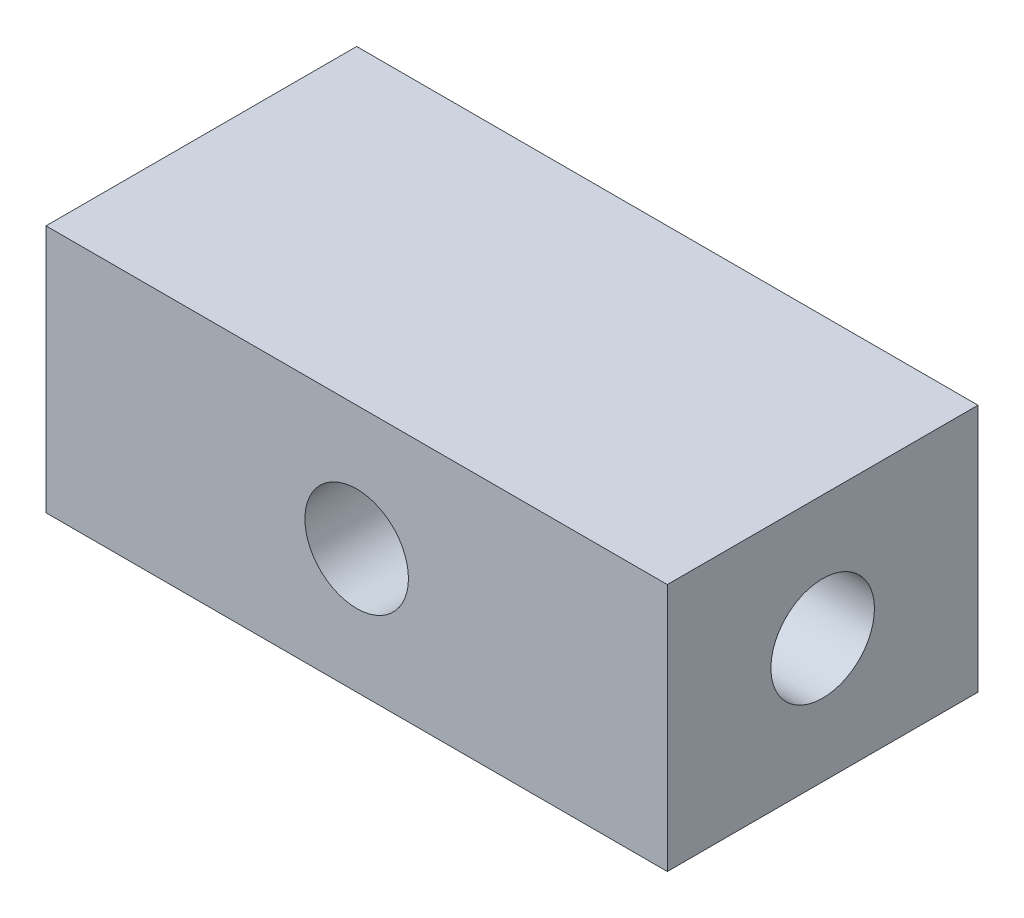
ISO-10303-21;
HEADER;
FILE_DESCRIPTION(('STEP AP214'),'2;1');
FILE_NAME('part.step','',(''),(''),'','','');
FILE_SCHEMA(('AUTOMOTIVE_DESIGN { 1 0 10303 214 1 1 1 1 }'));
ENDSEC;
DATA;
#1=APPLICATION_CONTEXT('core data for automotive mechanical design processes');
#2=APPLICATION_PROTOCOL_DEFINITION('international standard','automotive_design',2000,#1);
#3=PRODUCT_CONTEXT('',#1,'mechanical');
#4=PRODUCT('Part','Part','',(#3));
#5=PRODUCT_RELATED_PRODUCT_CATEGORY('part','',(#4));
#6=PRODUCT_DEFINITION_FORMATION('','',#4);
#7=PRODUCT_DEFINITION_CONTEXT('part definition',#1,'design');
#8=PRODUCT_DEFINITION('design','',#6,#7);
#9=PRODUCT_DEFINITION_SHAPE('','',#8);
#10=(LENGTH_UNIT() NAMED_UNIT(*) SI_UNIT(.MILLI.,.METRE.));
#11=(NAMED_UNIT(*) PLANE_ANGLE_UNIT() SI_UNIT($,.RADIAN.));
#12=(NAMED_UNIT(*) SI_UNIT($,.STERADIAN.) SOLID_ANGLE_UNIT());
#13=UNCERTAINTY_MEASURE_WITH_UNIT(LENGTH_MEASURE(1.E-05),#10,'distance_accuracy_value','');
#14=(GEOMETRIC_REPRESENTATION_CONTEXT(3) GLOBAL_UNCERTAINTY_ASSIGNED_CONTEXT((#13)) GLOBAL_UNIT_ASSIGNED_CONTEXT((#10,
#11,#12)) REPRESENTATION_CONTEXT('',''));
#15=CARTESIAN_POINT('',(0.,0.,0.));
#16=DIRECTION('',(0.,0.,1.));
#17=DIRECTION('',(1.,0.,0.));
#18=AXIS2_PLACEMENT_3D('',#15,#16,#17);
#19=CARTESIAN_POINT('',(0.,0.,7.5));
#20=DIRECTION('',(0.,0.,-1.));
#21=DIRECTION('',(-1.,0.,0.));
#22=AXIS2_PLACEMENT_3D('',#19,#20,#21);
#23=CYLINDRICAL_SURFACE('',#22,2.5);
#24=CARTESIAN_POINT('',(0.,0.,0.));
#25=DIRECTION('',(0.707106781186547,0.,-0.707106781186547));
#26=DIRECTION('',(-0.707106781186547,0.,-0.707106781186547));
#27=AXIS2_PLACEMENT_3D('',#24,#25,#26);
#28=ELLIPSE('',#27,3.53553390593274,2.5);
#29=CARTESIAN_POINT('',(0.,-2.5,0.));
#30=VERTEX_POINT('',#29);
#31=CARTESIAN_POINT('',(0.,2.5,0.));
#32=VERTEX_POINT('',#31);
#33=EDGE_CURVE('E11',#30,#32,#28,.F.);
#34=ORIENTED_EDGE('',*,*,#33,.F.);
#35=CARTESIAN_POINT('',(0.,0.,0.));
#36=DIRECTION('',(-0.707106781186547,0.,-0.707106781186547));
#37=DIRECTION('',(0.707106781186547,0.,-0.707106781186547));
#38=AXIS2_PLACEMENT_3D('',#35,#36,#37);
#39=ELLIPSE('',#38,3.53553390593274,2.5);
#40=EDGE_CURVE('E48',#32,#30,#39,.F.);
#41=ORIENTED_EDGE('',*,*,#40,.F.);
#42=EDGE_LOOP('',(#34,#41));
#43=FACE_BOUND('',#42,.T.);
#44=CARTESIAN_POINT('',(0.,0.,7.5));
#45=DIRECTION('',(0.,0.,1.));
#46=DIRECTION('',(1.,0.,0.));
#47=AXIS2_PLACEMENT_3D('',#44,#45,#46);
#48=CIRCLE('',#47,2.5);
#49=CARTESIAN_POINT('',(2.5,0.,7.5));
#50=VERTEX_POINT('',#49);
#51=EDGE_CURVE('E123',#50,#50,#48,.T.);
#52=ORIENTED_EDGE('',*,*,#51,.T.);
#53=EDGE_LOOP('',(#52));
#54=FACE_BOUND('',#53,.T.);
#55=ADVANCED_FACE('F34',(#43,#54),#23,.F.);
#56=CARTESIAN_POINT('',(-15.,6.,7.5));
#57=DIRECTION('',(0.,0.,1.));
#58=DIRECTION('',(1.,0.,0.));
#59=AXIS2_PLACEMENT_3D('',#56,#57,#58);
#60=PLANE('',#59);
#61=DIRECTION('',(0.,-1.,0.));
#62=VECTOR('',#61,1.);
#63=CARTESIAN_POINT('',(-15.,-6.,7.5));
#64=LINE('',#63,#62);
#65=CARTESIAN_POINT('',(-15.,6.,7.5));
#66=VERTEX_POINT('',#65);
#67=CARTESIAN_POINT('',(-15.,-6.,7.5));
#68=VERTEX_POINT('',#67);
#69=EDGE_CURVE('E115',#66,#68,#64,.T.);
#70=ORIENTED_EDGE('',*,*,#69,.T.);
#71=DIRECTION('',(1.,0.,0.));
#72=VECTOR('',#71,1.);
#73=CARTESIAN_POINT('',(15.,-6.,7.5));
#74=LINE('',#73,#72);
#75=CARTESIAN_POINT('',(15.,-6.,7.5));
#76=VERTEX_POINT('',#75);
#77=EDGE_CURVE('E86',#68,#76,#74,.T.);
#78=ORIENTED_EDGE('',*,*,#77,.T.);
#79=DIRECTION('',(0.,1.,0.));
#80=VECTOR('',#79,1.);
#81=CARTESIAN_POINT('',(15.,-6.,7.5));
#82=LINE('',#81,#80);
#83=CARTESIAN_POINT('',(15.,6.,7.5));
#84=VERTEX_POINT('',#83);
#85=EDGE_CURVE('E125',#76,#84,#82,.T.);
#86=ORIENTED_EDGE('',*,*,#85,.T.);
#87=DIRECTION('',(-1.,0.,0.));
#88=VECTOR('',#87,1.);
#89=CARTESIAN_POINT('',(15.,6.,7.5));
#90=LINE('',#89,#88);
#91=EDGE_CURVE('E57',#84,#66,#90,.T.);
#92=ORIENTED_EDGE('',*,*,#91,.T.);
#93=EDGE_LOOP('',(#70,#78,#86,#92));
#94=FACE_BOUND('',#93,.T.);
#95=ORIENTED_EDGE('',*,*,#51,.F.);
#96=EDGE_LOOP('',(#95));
#97=FACE_BOUND('',#96,.T.);
#98=ADVANCED_FACE('F157',(#94,#97),#60,.T.);
#99=CARTESIAN_POINT('',(-15.,6.,-7.5));
#100=DIRECTION('',(0.,0.,1.));
#101=DIRECTION('',(1.,0.,0.));
#102=AXIS2_PLACEMENT_3D('',#99,#100,#101);
#103=PLANE('',#102);
#104=DIRECTION('',(0.,-1.,0.));
#105=VECTOR('',#104,1.);
#106=CARTESIAN_POINT('',(-15.,-6.,-7.5));
#107=LINE('',#106,#105);
#108=CARTESIAN_POINT('',(-15.,6.,-7.5));
#109=VERTEX_POINT('',#108);
#110=CARTESIAN_POINT('',(-15.,-6.,-7.5));
#111=VERTEX_POINT('',#110);
#112=EDGE_CURVE('E120',#109,#111,#107,.T.);
#113=ORIENTED_EDGE('',*,*,#112,.F.);
#114=DIRECTION('',(-1.,0.,0.));
#115=VECTOR('',#114,1.);
#116=CARTESIAN_POINT('',(15.,6.,-7.5));
#117=LINE('',#116,#115);
#118=CARTESIAN_POINT('',(15.,6.,-7.5));
#119=VERTEX_POINT('',#118);
#120=EDGE_CURVE('E78',#119,#109,#117,.T.);
#121=ORIENTED_EDGE('',*,*,#120,.F.);
#122=DIRECTION('',(0.,1.,0.));
#123=VECTOR('',#122,1.);
#124=CARTESIAN_POINT('',(15.,-6.,-7.5));
#125=LINE('',#124,#123);
#126=CARTESIAN_POINT('',(15.,-6.,-7.5));
#127=VERTEX_POINT('',#126);
#128=EDGE_CURVE('E116',#127,#119,#125,.T.);
#129=ORIENTED_EDGE('',*,*,#128,.F.);
#130=DIRECTION('',(1.,0.,0.));
#131=VECTOR('',#130,1.);
#132=CARTESIAN_POINT('',(15.,-6.,-7.5));
#133=LINE('',#132,#131);
#134=EDGE_CURVE('E118',#111,#127,#133,.T.);
#135=ORIENTED_EDGE('',*,*,#134,.F.);
#136=EDGE_LOOP('',(#113,#121,#129,#135));
#137=FACE_BOUND('',#136,.T.);
#138=CARTESIAN_POINT('',(0.,0.,-7.5));
#139=DIRECTION('',(0.,0.,1.));
#140=DIRECTION('',(1.,0.,0.));
#141=AXIS2_PLACEMENT_3D('',#138,#139,#140);
#142=CIRCLE('',#141,2.5);
#143=CARTESIAN_POINT('',(2.5,0.,-7.5));
#144=VERTEX_POINT('',#143);
#145=EDGE_CURVE('E129',#144,#144,#142,.T.);
#146=ORIENTED_EDGE('',*,*,#145,.T.);
#147=EDGE_LOOP('',(#146));
#148=FACE_BOUND('',#147,.T.);
#149=ADVANCED_FACE('F152',(#137,#148),#103,.F.);
#150=CARTESIAN_POINT('',(-15.,-6.,7.5));
#151=DIRECTION('',(1.,0.,0.));
#152=DIRECTION('',(0.,0.,-1.));
#153=AXIS2_PLACEMENT_3D('',#150,#151,#152);
#154=PLANE('',#153);
#155=CARTESIAN_POINT('',(-15.,0.,0.));
#156=DIRECTION('',(1.,0.,0.));
#157=DIRECTION('',(0.,0.,-1.));
#158=AXIS2_PLACEMENT_3D('',#155,#156,#157);
#159=CIRCLE('',#158,2.5);
#160=CARTESIAN_POINT('',(-15.,0.,-2.5));
#161=VERTEX_POINT('',#160);
#162=EDGE_CURVE('E132',#161,#161,#159,.F.);
#163=ORIENTED_EDGE('',*,*,#162,.F.);
#164=EDGE_LOOP('',(#163));
#165=FACE_BOUND('',#164,.T.);
#166=ORIENTED_EDGE('',*,*,#112,.T.);
#167=DIRECTION('',(0.,0.,-1.));
#168=VECTOR('',#167,1.);
#169=CARTESIAN_POINT('',(-15.,-6.,7.5));
#170=LINE('',#169,#168);
#171=EDGE_CURVE('E100',#68,#111,#170,.T.);
#172=ORIENTED_EDGE('',*,*,#171,.F.);
#173=ORIENTED_EDGE('',*,*,#69,.F.);
#174=DIRECTION('',(0.,0.,-1.));
#175=VECTOR('',#174,1.);
#176=CARTESIAN_POINT('',(-15.,6.,7.5));
#177=LINE('',#176,#175);
#178=EDGE_CURVE('E112',#66,#109,#177,.T.);
#179=ORIENTED_EDGE('',*,*,#178,.T.);
#180=EDGE_LOOP('',(#166,#172,#173,#179));
#181=FACE_BOUND('',#180,.T.);
#182=ADVANCED_FACE('F36',(#165,#181),#154,.F.);
#183=CARTESIAN_POINT('',(15.,-6.,7.5));
#184=DIRECTION('',(0.,1.,0.));
#185=DIRECTION('',(-1.,0.,0.));
#186=AXIS2_PLACEMENT_3D('',#183,#184,#185);
#187=PLANE('',#186);
#188=ORIENTED_EDGE('',*,*,#134,.T.);
#189=DIRECTION('',(0.,0.,-1.));
#190=VECTOR('',#189,1.);
#191=CARTESIAN_POINT('',(15.,-6.,7.5));
#192=LINE('',#191,#190);
#193=EDGE_CURVE('E107',#76,#127,#192,.T.);
#194=ORIENTED_EDGE('',*,*,#193,.F.);
#195=ORIENTED_EDGE('',*,*,#77,.F.);
#196=ORIENTED_EDGE('',*,*,#171,.T.);
#197=EDGE_LOOP('',(#188,#194,#195,#196));
#198=FACE_BOUND('',#197,.T.);
#199=ADVANCED_FACE('F145',(#198),#187,.F.);
#200=CARTESIAN_POINT('',(15.,-6.,7.5));
#201=DIRECTION('',(-1.,0.,0.));
#202=DIRECTION('',(0.,0.,1.));
#203=AXIS2_PLACEMENT_3D('',#200,#201,#202);
#204=PLANE('',#203);
#205=CARTESIAN_POINT('',(15.,0.,0.));
#206=DIRECTION('',(1.,0.,0.));
#207=DIRECTION('',(0.,0.,-1.));
#208=AXIS2_PLACEMENT_3D('',#205,#206,#207);
#209=CIRCLE('',#208,2.5);
#210=CARTESIAN_POINT('',(15.,0.,-2.5));
#211=VERTEX_POINT('',#210);
#212=EDGE_CURVE('E137',#211,#211,#209,.T.);
#213=ORIENTED_EDGE('',*,*,#212,.F.);
#214=EDGE_LOOP('',(#213));
#215=FACE_BOUND('',#214,.T.);
#216=ORIENTED_EDGE('',*,*,#128,.T.);
#217=DIRECTION('',(0.,0.,-1.));
#218=VECTOR('',#217,1.);
#219=CARTESIAN_POINT('',(15.,6.,7.5));
#220=LINE('',#219,#218);
#221=EDGE_CURVE('E110',#84,#119,#220,.T.);
#222=ORIENTED_EDGE('',*,*,#221,.F.);
#223=ORIENTED_EDGE('',*,*,#85,.F.);
#224=ORIENTED_EDGE('',*,*,#193,.T.);
#225=EDGE_LOOP('',(#216,#222,#223,#224));
#226=FACE_BOUND('',#225,.T.);
#227=ADVANCED_FACE('F141',(#215,#226),#204,.F.);
#228=CARTESIAN_POINT('',(15.,6.,7.5));
#229=DIRECTION('',(0.,-1.,0.));
#230=DIRECTION('',(1.,0.,0.));
#231=AXIS2_PLACEMENT_3D('',#228,#229,#230);
#232=PLANE('',#231);
#233=ORIENTED_EDGE('',*,*,#120,.T.);
#234=ORIENTED_EDGE('',*,*,#178,.F.);
#235=ORIENTED_EDGE('',*,*,#91,.F.);
#236=ORIENTED_EDGE('',*,*,#221,.T.);
#237=EDGE_LOOP('',(#233,#234,#235,#236));
#238=FACE_BOUND('',#237,.T.);
#239=ADVANCED_FACE('F144',(#238),#232,.F.);
#240=CARTESIAN_POINT('',(0.,0.,0.));
#241=DIRECTION('',(0.707106781186547,0.,-0.707106781186547));
#242=DIRECTION('',(-0.707106781186547,0.,-0.707106781186547));
#243=AXIS2_PLACEMENT_3D('',#240,#241,#242);
#244=ELLIPSE('',#243,3.53553390593274,2.5);
#245=EDGE_CURVE('E42',#30,#32,#244,.T.);
#246=ORIENTED_EDGE('',*,*,#245,.F.);
#247=CARTESIAN_POINT('',(0.,0.,0.));
#248=DIRECTION('',(-0.707106781186547,0.,-0.707106781186547));
#249=DIRECTION('',(0.707106781186547,0.,-0.707106781186547));
#250=AXIS2_PLACEMENT_3D('',#247,#248,#249);
#251=ELLIPSE('',#250,3.53553390593274,2.5);
#252=EDGE_CURVE('E91',#32,#30,#251,.T.);
#253=ORIENTED_EDGE('',*,*,#252,.F.);
#254=EDGE_LOOP('',(#246,#253));
#255=FACE_BOUND('',#254,.T.);
#256=ORIENTED_EDGE('',*,*,#145,.F.);
#257=EDGE_LOOP('',(#256));
#258=FACE_BOUND('',#257,.T.);
#259=ADVANCED_FACE('F103',(#255,#258),#23,.F.);
#260=CARTESIAN_POINT('',(-22.0710678118655,0.,0.));
#261=DIRECTION('',(1.,0.,0.));
#262=DIRECTION('',(0.,0.,-1.));
#263=AXIS2_PLACEMENT_3D('',#260,#261,#262);
#264=CYLINDRICAL_SURFACE('',#263,2.5);
#265=ORIENTED_EDGE('',*,*,#245,.T.);
#266=ORIENTED_EDGE('',*,*,#40,.T.);
#267=EDGE_LOOP('',(#265,#266));
#268=FACE_BOUND('',#267,.T.);
#269=ORIENTED_EDGE('',*,*,#162,.T.);
#270=EDGE_LOOP('',(#269));
#271=FACE_BOUND('',#270,.T.);
#272=ADVANCED_FACE('F98',(#268,#271),#264,.F.);
#273=ORIENTED_EDGE('',*,*,#33,.T.);
#274=ORIENTED_EDGE('',*,*,#252,.T.);
#275=EDGE_LOOP('',(#273,#274));
#276=FACE_BOUND('',#275,.T.);
#277=ORIENTED_EDGE('',*,*,#212,.T.);
#278=EDGE_LOOP('',(#277));
#279=FACE_BOUND('',#278,.T.);
#280=ADVANCED_FACE('F92',(#276,#279),#264,.F.);
#281=CLOSED_SHELL('',(#55,#98,#149,#182,#199,#227,#239,#259,#272,#280));
#282=MANIFOLD_SOLID_BREP('B2',#281);
#283=ADVANCED_BREP_SHAPE_REPRESENTATION('',(#18,#282),#14);
#284=SHAPE_DEFINITION_REPRESENTATION(#9,#283);
ENDSEC;
END-ISO-10303-21;
